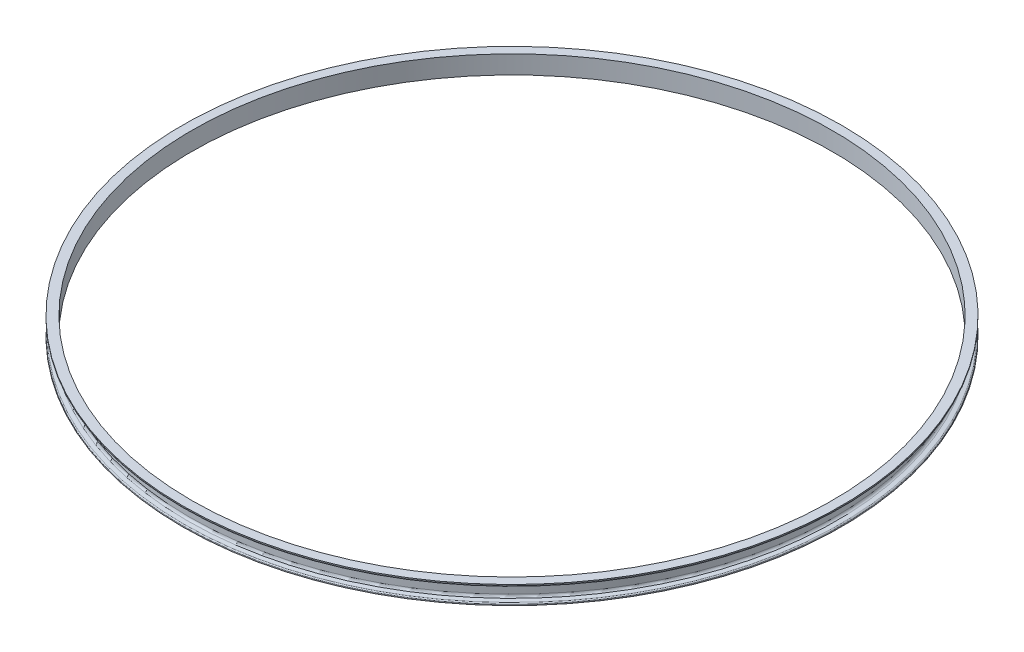
ISO-10303-21;
HEADER;
FILE_DESCRIPTION(('STEP AP214'),'2;1');
FILE_NAME('part.step','',(''),(''),'','','');
FILE_SCHEMA(('AUTOMOTIVE_DESIGN { 1 0 10303 214 1 1 1 1 }'));
ENDSEC;
DATA;
#1=APPLICATION_CONTEXT('core data for automotive mechanical design processes');
#2=APPLICATION_PROTOCOL_DEFINITION('international standard','automotive_design',2000,#1);
#3=PRODUCT_CONTEXT('',#1,'mechanical');
#4=PRODUCT('Part','Part','',(#3));
#5=PRODUCT_RELATED_PRODUCT_CATEGORY('part','',(#4));
#6=PRODUCT_DEFINITION_FORMATION('','',#4);
#7=PRODUCT_DEFINITION_CONTEXT('part definition',#1,'design');
#8=PRODUCT_DEFINITION('design','',#6,#7);
#9=PRODUCT_DEFINITION_SHAPE('','',#8);
#10=(LENGTH_UNIT() NAMED_UNIT(*) SI_UNIT(.MILLI.,.METRE.));
#11=(NAMED_UNIT(*) PLANE_ANGLE_UNIT() SI_UNIT($,.RADIAN.));
#12=(NAMED_UNIT(*) SI_UNIT($,.STERADIAN.) SOLID_ANGLE_UNIT());
#13=UNCERTAINTY_MEASURE_WITH_UNIT(LENGTH_MEASURE(1.E-05),#10,'distance_accuracy_value','');
#14=(GEOMETRIC_REPRESENTATION_CONTEXT(3) GLOBAL_UNCERTAINTY_ASSIGNED_CONTEXT((#13)) GLOBAL_UNIT_ASSIGNED_CONTEXT((#10,
#11,#12)) REPRESENTATION_CONTEXT('',''));
#15=CARTESIAN_POINT('',(0.,0.,0.));
#16=DIRECTION('',(0.,0.,1.));
#17=DIRECTION('',(1.,0.,0.));
#18=AXIS2_PLACEMENT_3D('',#15,#16,#17);
#19=CARTESIAN_POINT('',(0.,0.,0.));
#20=DIRECTION('',(0.,1.,0.));
#21=DIRECTION('',(0.,0.,1.));
#22=AXIS2_PLACEMENT_3D('',#19,#20,#21);
#23=PLANE('',#22);
#24=CARTESIAN_POINT('',(-700.,0.,0.));
#25=DIRECTION('',(0.,1.,0.));
#26=DIRECTION('',(0.,0.,1.));
#27=AXIS2_PLACEMENT_3D('',#24,#25,#26);
#28=CIRCLE('',#27,720.);
#29=CARTESIAN_POINT('',(-700.,0.,720.));
#30=VERTEX_POINT('',#29);
#31=EDGE_CURVE('E10',#30,#30,#28,.T.);
#32=ORIENTED_EDGE('',*,*,#31,.F.);
#33=EDGE_LOOP('',(#32));
#34=FACE_BOUND('',#33,.T.);
#35=CARTESIAN_POINT('',(-700.,0.,0.));
#36=DIRECTION('',(0.,1.,0.));
#37=DIRECTION('',(0.,0.,1.));
#38=AXIS2_PLACEMENT_3D('',#35,#36,#37);
#39=CIRCLE('',#38,700.);
#40=CARTESIAN_POINT('',(-700.,0.,700.));
#41=VERTEX_POINT('',#40);
#42=EDGE_CURVE('E70',#41,#41,#39,.T.);
#43=ORIENTED_EDGE('',*,*,#42,.T.);
#44=EDGE_LOOP('',(#43));
#45=FACE_BOUND('',#44,.T.);
#46=ADVANCED_FACE('F30',(#34,#45),#23,.F.);
#47=CARTESIAN_POINT('',(-700.,40.,0.));
#48=DIRECTION('',(0.,1.,0.));
#49=DIRECTION('',(0.,0.,1.));
#50=AXIS2_PLACEMENT_3D('',#47,#48,#49);
#51=CYLINDRICAL_SURFACE('',#50,720.);
#52=CARTESIAN_POINT('',(-700.,2.13211649018093,0.));
#53=DIRECTION('',(0.,1.,0.));
#54=DIRECTION('',(0.,0.,1.));
#55=AXIS2_PLACEMENT_3D('',#52,#53,#54);
#56=CIRCLE('',#55,720.);
#57=CARTESIAN_POINT('',(-700.,2.13211649018093,720.));
#58=VERTEX_POINT('',#57);
#59=EDGE_CURVE('E36',#58,#58,#56,.T.);
#60=ORIENTED_EDGE('',*,*,#59,.F.);
#61=EDGE_LOOP('',(#60));
#62=FACE_BOUND('',#61,.T.);
#63=ORIENTED_EDGE('',*,*,#31,.T.);
#64=EDGE_LOOP('',(#63));
#65=FACE_BOUND('',#64,.T.);
#66=ADVANCED_FACE('F131',(#62,#65),#51,.T.);
#67=CARTESIAN_POINT('',(-700.,2.13211649018093,0.));
#68=DIRECTION('',(0.,1.,0.));
#69=DIRECTION('',(0.,0.,1.));
#70=AXIS2_PLACEMENT_3D('',#67,#68,#69);
#71=TOROIDAL_SURFACE('',#70,717.5,2.5);
#72=CARTESIAN_POINT('',(-700.,4.59809643761132,0.));
#73=DIRECTION('',(0.,1.,0.));
#74=DIRECTION('',(0.,0.,1.));
#75=AXIS2_PLACEMENT_3D('',#72,#73,#74);
#76=CIRCLE('',#75,717.911026640099);
#77=CARTESIAN_POINT('',(-700.,4.59809643761132,717.911026640099));
#78=VERTEX_POINT('',#77);
#79=EDGE_CURVE('E40',#78,#78,#76,.T.);
#80=ORIENTED_EDGE('',*,*,#79,.F.);
#81=EDGE_LOOP('',(#80));
#82=FACE_BOUND('',#81,.T.);
#83=ORIENTED_EDGE('',*,*,#59,.T.);
#84=EDGE_LOOP('',(#83));
#85=FACE_BOUND('',#84,.T.);
#86=ADVANCED_FACE('F126',(#82,#85),#71,.T.);
#87=CARTESIAN_POINT('',(-700.,4.59809643761132,0.));
#88=DIRECTION('',(0.,-1.,0.));
#89=DIRECTION('',(0.,0.,-1.));
#90=AXIS2_PLACEMENT_3D('',#87,#88,#89);
#91=CONICAL_SURFACE('',#90,717.911026640099,1.40563581967867);
#92=CARTESIAN_POINT('',(-700.,6.0537159373144,0.));
#93=DIRECTION('',(0.,1.,0.));
#94=DIRECTION('',(0.,0.,1.));
#95=AXIS2_PLACEMENT_3D('',#92,#93,#94);
#96=CIRCLE('',#95,709.177946719802);
#97=CARTESIAN_POINT('',(-700.,6.0537159373144,709.177946719802));
#98=VERTEX_POINT('',#97);
#99=EDGE_CURVE('E44',#98,#98,#96,.T.);
#100=ORIENTED_EDGE('',*,*,#99,.F.);
#101=EDGE_LOOP('',(#100));
#102=FACE_BOUND('',#101,.T.);
#103=ORIENTED_EDGE('',*,*,#79,.T.);
#104=EDGE_LOOP('',(#103));
#105=FACE_BOUND('',#104,.T.);
#106=ADVANCED_FACE('F120',(#102,#105),#91,.T.);
#107=CARTESIAN_POINT('',(-700.,10.9856758321752,0.));
#108=DIRECTION('',(0.,1.,0.));
#109=DIRECTION('',(0.,0.,1.));
#110=AXIS2_PLACEMENT_3D('',#107,#108,#109);
#111=TOROIDAL_SURFACE('',#110,710.,5.);
#112=CARTESIAN_POINT('',(-700.,10.9856758321752,0.));
#113=DIRECTION('',(0.,1.,0.));
#114=DIRECTION('',(0.,0.,1.));
#115=AXIS2_PLACEMENT_3D('',#112,#113,#114);
#116=CIRCLE('',#115,705.);
#117=CARTESIAN_POINT('',(-700.,10.9856758321752,705.));
#118=VERTEX_POINT('',#117);
#119=EDGE_CURVE('E49',#118,#118,#116,.T.);
#120=ORIENTED_EDGE('',*,*,#119,.F.);
#121=EDGE_LOOP('',(#120));
#122=FACE_BOUND('',#121,.T.);
#123=ORIENTED_EDGE('',*,*,#99,.T.);
#124=EDGE_LOOP('',(#123));
#125=FACE_BOUND('',#124,.T.);
#126=ADVANCED_FACE('F114',(#122,#125),#111,.F.);
#127=CARTESIAN_POINT('',(-700.,40.,0.));
#128=DIRECTION('',(0.,1.,0.));
#129=DIRECTION('',(0.,0.,1.));
#130=AXIS2_PLACEMENT_3D('',#127,#128,#129);
#131=CYLINDRICAL_SURFACE('',#130,705.);
#132=CARTESIAN_POINT('',(-700.,29.0143241678248,0.));
#133=DIRECTION('',(0.,1.,0.));
#134=DIRECTION('',(0.,0.,1.));
#135=AXIS2_PLACEMENT_3D('',#132,#133,#134);
#136=CIRCLE('',#135,705.);
#137=CARTESIAN_POINT('',(-700.,29.0143241678248,705.));
#138=VERTEX_POINT('',#137);
#139=EDGE_CURVE('E52',#138,#138,#136,.T.);
#140=ORIENTED_EDGE('',*,*,#139,.F.);
#141=EDGE_LOOP('',(#140));
#142=FACE_BOUND('',#141,.T.);
#143=ORIENTED_EDGE('',*,*,#119,.T.);
#144=EDGE_LOOP('',(#143));
#145=FACE_BOUND('',#144,.T.);
#146=ADVANCED_FACE('F108',(#142,#145),#131,.T.);
#147=CARTESIAN_POINT('',(-700.,29.0143241678248,0.));
#148=DIRECTION('',(0.,1.,0.));
#149=DIRECTION('',(0.,0.,1.));
#150=AXIS2_PLACEMENT_3D('',#147,#148,#149);
#151=TOROIDAL_SURFACE('',#150,710.,5.);
#152=CARTESIAN_POINT('',(-700.,33.9462840626856,0.));
#153=DIRECTION('',(0.,1.,0.));
#154=DIRECTION('',(0.,0.,1.));
#155=AXIS2_PLACEMENT_3D('',#152,#153,#154);
#156=CIRCLE('',#155,709.177946719802);
#157=CARTESIAN_POINT('',(-700.,33.9462840626856,709.177946719802));
#158=VERTEX_POINT('',#157);
#159=EDGE_CURVE('E55',#158,#158,#156,.T.);
#160=ORIENTED_EDGE('',*,*,#159,.F.);
#161=EDGE_LOOP('',(#160));
#162=FACE_BOUND('',#161,.T.);
#163=ORIENTED_EDGE('',*,*,#139,.T.);
#164=EDGE_LOOP('',(#163));
#165=FACE_BOUND('',#164,.T.);
#166=ADVANCED_FACE('F102',(#162,#165),#151,.F.);
#167=CARTESIAN_POINT('',(-700.,33.9462840626856,0.));
#168=DIRECTION('',(0.,1.,0.));
#169=DIRECTION('',(0.,0.,1.));
#170=AXIS2_PLACEMENT_3D('',#167,#168,#169);
#171=CONICAL_SURFACE('',#170,709.177946719802,1.40563581967867);
#172=CARTESIAN_POINT('',(-700.,35.4019035623887,0.));
#173=DIRECTION('',(0.,1.,0.));
#174=DIRECTION('',(0.,0.,1.));
#175=AXIS2_PLACEMENT_3D('',#172,#173,#174);
#176=CIRCLE('',#175,717.911026640099);
#177=CARTESIAN_POINT('',(-700.,35.4019035623887,717.911026640099));
#178=VERTEX_POINT('',#177);
#179=EDGE_CURVE('E58',#178,#178,#176,.T.);
#180=ORIENTED_EDGE('',*,*,#179,.F.);
#181=EDGE_LOOP('',(#180));
#182=FACE_BOUND('',#181,.T.);
#183=ORIENTED_EDGE('',*,*,#159,.T.);
#184=EDGE_LOOP('',(#183));
#185=FACE_BOUND('',#184,.T.);
#186=ADVANCED_FACE('F96',(#182,#185),#171,.T.);
#187=CARTESIAN_POINT('',(-700.,37.8678835098191,0.));
#188=DIRECTION('',(0.,1.,0.));
#189=DIRECTION('',(0.,0.,1.));
#190=AXIS2_PLACEMENT_3D('',#187,#188,#189);
#191=TOROIDAL_SURFACE('',#190,717.5,2.5);
#192=CARTESIAN_POINT('',(-700.,37.8678835098191,0.));
#193=DIRECTION('',(0.,1.,0.));
#194=DIRECTION('',(0.,0.,1.));
#195=AXIS2_PLACEMENT_3D('',#192,#193,#194);
#196=CIRCLE('',#195,720.);
#197=CARTESIAN_POINT('',(-700.,37.8678835098191,720.));
#198=VERTEX_POINT('',#197);
#199=EDGE_CURVE('E61',#198,#198,#196,.T.);
#200=ORIENTED_EDGE('',*,*,#199,.F.);
#201=EDGE_LOOP('',(#200));
#202=FACE_BOUND('',#201,.T.);
#203=ORIENTED_EDGE('',*,*,#179,.T.);
#204=EDGE_LOOP('',(#203));
#205=FACE_BOUND('',#204,.T.);
#206=ADVANCED_FACE('F90',(#202,#205),#191,.T.);
#207=CARTESIAN_POINT('',(-700.,40.,0.));
#208=DIRECTION('',(0.,1.,0.));
#209=DIRECTION('',(0.,0.,1.));
#210=AXIS2_PLACEMENT_3D('',#207,#208,#209);
#211=CYLINDRICAL_SURFACE('',#210,720.);
#212=CARTESIAN_POINT('',(-700.,40.,0.));
#213=DIRECTION('',(0.,1.,0.));
#214=DIRECTION('',(0.,0.,1.));
#215=AXIS2_PLACEMENT_3D('',#212,#213,#214);
#216=CIRCLE('',#215,720.);
#217=CARTESIAN_POINT('',(-700.,40.,720.));
#218=VERTEX_POINT('',#217);
#219=EDGE_CURVE('E64',#218,#218,#216,.T.);
#220=ORIENTED_EDGE('',*,*,#219,.F.);
#221=EDGE_LOOP('',(#220));
#222=FACE_BOUND('',#221,.T.);
#223=ORIENTED_EDGE('',*,*,#199,.T.);
#224=EDGE_LOOP('',(#223));
#225=FACE_BOUND('',#224,.T.);
#226=ADVANCED_FACE('F84',(#222,#225),#211,.T.);
#227=CARTESIAN_POINT('',(0.,40.,0.));
#228=DIRECTION('',(0.,-1.,0.));
#229=DIRECTION('',(0.,0.,-1.));
#230=AXIS2_PLACEMENT_3D('',#227,#228,#229);
#231=PLANE('',#230);
#232=CARTESIAN_POINT('',(-700.,40.,0.));
#233=DIRECTION('',(0.,1.,0.));
#234=DIRECTION('',(0.,0.,1.));
#235=AXIS2_PLACEMENT_3D('',#232,#233,#234);
#236=CIRCLE('',#235,700.);
#237=CARTESIAN_POINT('',(-700.,40.,700.));
#238=VERTEX_POINT('',#237);
#239=EDGE_CURVE('E67',#238,#238,#236,.T.);
#240=ORIENTED_EDGE('',*,*,#239,.F.);
#241=EDGE_LOOP('',(#240));
#242=FACE_BOUND('',#241,.T.);
#243=ORIENTED_EDGE('',*,*,#219,.T.);
#244=EDGE_LOOP('',(#243));
#245=FACE_BOUND('',#244,.T.);
#246=ADVANCED_FACE('F78',(#242,#245),#231,.F.);
#247=CARTESIAN_POINT('',(-700.,40.,0.));
#248=DIRECTION('',(0.,1.,0.));
#249=DIRECTION('',(0.,0.,1.));
#250=AXIS2_PLACEMENT_3D('',#247,#248,#249);
#251=CYLINDRICAL_SURFACE('',#250,700.);
#252=ORIENTED_EDGE('',*,*,#42,.F.);
#253=EDGE_LOOP('',(#252));
#254=FACE_BOUND('',#253,.T.);
#255=ORIENTED_EDGE('',*,*,#239,.T.);
#256=EDGE_LOOP('',(#255));
#257=FACE_BOUND('',#256,.T.);
#258=ADVANCED_FACE('F75',(#254,#257),#251,.F.);
#259=CLOSED_SHELL('',(#46,#66,#86,#106,#126,#146,#166,#186,#206,#226,#246,#258));
#260=MANIFOLD_SOLID_BREP('B2',#259);
#261=ADVANCED_BREP_SHAPE_REPRESENTATION('',(#18,#260),#14);
#262=SHAPE_DEFINITION_REPRESENTATION(#9,#261);
ENDSEC;
END-ISO-10303-21;
